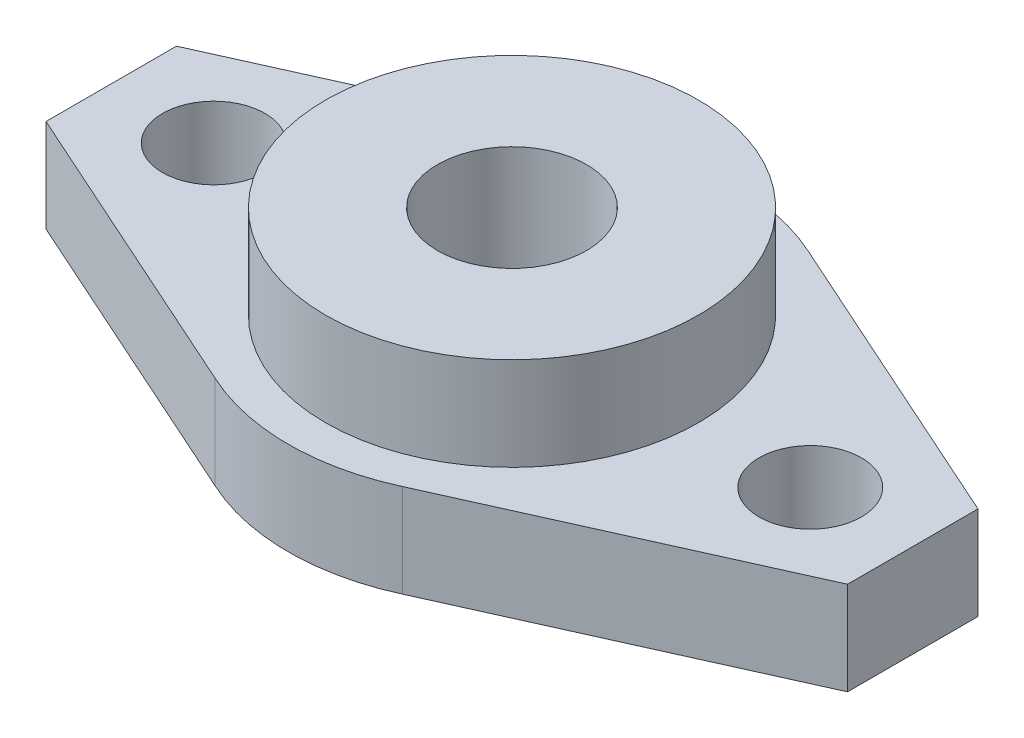
ISO-10303-21;
HEADER;
FILE_DESCRIPTION(('STEP AP214'),'2;1');
FILE_NAME('part.step','',(''),(''),'','','');
FILE_SCHEMA(('AUTOMOTIVE_DESIGN { 1 0 10303 214 1 1 1 1 }'));
ENDSEC;
DATA;
#1=APPLICATION_CONTEXT('core data for automotive mechanical design processes');
#2=APPLICATION_PROTOCOL_DEFINITION('international standard','automotive_design',2000,#1);
#3=PRODUCT_CONTEXT('',#1,'mechanical');
#4=PRODUCT('Part','Part','',(#3));
#5=PRODUCT_RELATED_PRODUCT_CATEGORY('part','',(#4));
#6=PRODUCT_DEFINITION_FORMATION('','',#4);
#7=PRODUCT_DEFINITION_CONTEXT('part definition',#1,'design');
#8=PRODUCT_DEFINITION('design','',#6,#7);
#9=PRODUCT_DEFINITION_SHAPE('','',#8);
#10=(LENGTH_UNIT() NAMED_UNIT(*) SI_UNIT(.MILLI.,.METRE.));
#11=(NAMED_UNIT(*) PLANE_ANGLE_UNIT() SI_UNIT($,.RADIAN.));
#12=(NAMED_UNIT(*) SI_UNIT($,.STERADIAN.) SOLID_ANGLE_UNIT());
#13=UNCERTAINTY_MEASURE_WITH_UNIT(LENGTH_MEASURE(1.E-05),#10,'distance_accuracy_value','');
#14=(GEOMETRIC_REPRESENTATION_CONTEXT(3) GLOBAL_UNCERTAINTY_ASSIGNED_CONTEXT((#13)) GLOBAL_UNIT_ASSIGNED_CONTEXT((#10,
#11,#12)) REPRESENTATION_CONTEXT('',''));
#15=CARTESIAN_POINT('',(0.,0.,0.));
#16=DIRECTION('',(0.,0.,1.));
#17=DIRECTION('',(1.,0.,0.));
#18=AXIS2_PLACEMENT_3D('',#15,#16,#17);
#19=CARTESIAN_POINT('',(0.,5.,0.));
#20=DIRECTION('',(0.,1.,0.));
#21=DIRECTION('',(0.,0.,1.));
#22=AXIS2_PLACEMENT_3D('',#19,#20,#21);
#23=PLANE('',#22);
#24=CARTESIAN_POINT('',(-16.,5.,0.));
#25=DIRECTION('',(0.,1.,0.));
#26=DIRECTION('',(0.,0.,1.));
#27=AXIS2_PLACEMENT_3D('',#24,#25,#26);
#28=CIRCLE('',#27,2.75);
#29=CARTESIAN_POINT('',(-16.,5.,2.75));
#30=VERTEX_POINT('',#29);
#31=EDGE_CURVE('E136',#30,#30,#28,.T.);
#32=ORIENTED_EDGE('',*,*,#31,.F.);
#33=EDGE_LOOP('',(#32));
#34=FACE_BOUND('',#33,.T.);
#35=CARTESIAN_POINT('',(16.,5.,0.));
#36=DIRECTION('',(0.,1.,0.));
#37=DIRECTION('',(0.,0.,1.));
#38=AXIS2_PLACEMENT_3D('',#35,#36,#37);
#39=CIRCLE('',#38,2.75);
#40=CARTESIAN_POINT('',(16.,5.,2.75));
#41=VERTEX_POINT('',#40);
#42=EDGE_CURVE('E129',#41,#41,#39,.T.);
#43=ORIENTED_EDGE('',*,*,#42,.F.);
#44=EDGE_LOOP('',(#43));
#45=FACE_BOUND('',#44,.T.);
#46=DIRECTION('',(-0.912263854888892,0.,-0.40960305060297));
#47=VECTOR('',#46,1.);
#48=CARTESIAN_POINT('',(4.91498637257068,5.,-10.9466089385009));
#49=LINE('',#48,#47);
#50=CARTESIAN_POINT('',(21.5,5.,-3.5));
#51=VERTEX_POINT('',#50);
#52=CARTESIAN_POINT('',(5.02544832268749,5.,-10.8970119370402));
#53=VERTEX_POINT('',#52);
#54=EDGE_CURVE('E163',#51,#53,#49,.T.);
#55=ORIENTED_EDGE('',*,*,#54,.T.);
#56=CARTESIAN_POINT('',(0.,5.,0.));
#57=DIRECTION('',(0.,1.,0.));
#58=DIRECTION('',(0.,0.,1.));
#59=AXIS2_PLACEMENT_3D('',#56,#57,#58);
#60=CIRCLE('',#59,12.);
#61=CARTESIAN_POINT('',(-5.02544832268749,5.,-10.8970119370402));
#62=VERTEX_POINT('',#61);
#63=EDGE_CURVE('E93',#53,#62,#60,.T.);
#64=ORIENTED_EDGE('',*,*,#63,.T.);
#65=DIRECTION('',(0.912263854888892,0.,-0.40960305060297));
#66=VECTOR('',#65,1.);
#67=CARTESIAN_POINT('',(-4.91498637257068,5.,-10.9466089385009));
#68=LINE('',#67,#66);
#69=CARTESIAN_POINT('',(-21.5,5.,-3.49999999999999));
#70=VERTEX_POINT('',#69);
#71=EDGE_CURVE('E176',#70,#62,#68,.T.);
#72=ORIENTED_EDGE('',*,*,#71,.F.);
#73=DIRECTION('',(0.,0.,1.));
#74=VECTOR('',#73,1.);
#75=CARTESIAN_POINT('',(-21.5,5.,0.));
#76=LINE('',#75,#74);
#77=CARTESIAN_POINT('',(-21.5,5.,3.50000000000001));
#78=VERTEX_POINT('',#77);
#79=EDGE_CURVE('E191',#70,#78,#76,.T.);
#80=ORIENTED_EDGE('',*,*,#79,.T.);
#81=DIRECTION('',(0.912263854888892,0.,0.40960305060297));
#82=VECTOR('',#81,1.);
#83=CARTESIAN_POINT('',(-4.91498637257067,5.,10.9466089385009));
#84=LINE('',#83,#82);
#85=CARTESIAN_POINT('',(-5.02544832268749,5.,10.8970119370402));
#86=VERTEX_POINT('',#85);
#87=EDGE_CURVE('E112',#78,#86,#84,.T.);
#88=ORIENTED_EDGE('',*,*,#87,.T.);
#89=CARTESIAN_POINT('',(5.02544832268749,5.,10.8970119370402));
#90=VERTEX_POINT('',#89);
#91=EDGE_CURVE('E106',#86,#90,#60,.T.);
#92=ORIENTED_EDGE('',*,*,#91,.T.);
#93=DIRECTION('',(-0.912263854888892,0.,0.40960305060297));
#94=VECTOR('',#93,1.);
#95=CARTESIAN_POINT('',(4.91498637257068,5.,10.9466089385009));
#96=LINE('',#95,#94);
#97=CARTESIAN_POINT('',(21.5,5.,3.5));
#98=VERTEX_POINT('',#97);
#99=EDGE_CURVE('E110',#98,#90,#96,.T.);
#100=ORIENTED_EDGE('',*,*,#99,.F.);
#101=DIRECTION('',(0.,0.,-1.));
#102=VECTOR('',#101,1.);
#103=CARTESIAN_POINT('',(21.5,5.,0.));
#104=LINE('',#103,#102);
#105=EDGE_CURVE('E54',#98,#51,#104,.T.);
#106=ORIENTED_EDGE('',*,*,#105,.T.);
#107=EDGE_LOOP('',(#55,#64,#72,#80,#88,#92,#100,#106));
#108=FACE_BOUND('',#107,.T.);
#109=CARTESIAN_POINT('',(0.,5.,0.));
#110=DIRECTION('',(0.,1.,0.));
#111=DIRECTION('',(0.,0.,1.));
#112=AXIS2_PLACEMENT_3D('',#109,#110,#111);
#113=CIRCLE('',#112,10.);
#114=CARTESIAN_POINT('',(0.,5.,10.));
#115=VERTEX_POINT('',#114);
#116=EDGE_CURVE('E195',#115,#115,#113,.T.);
#117=ORIENTED_EDGE('',*,*,#116,.F.);
#118=EDGE_LOOP('',(#117));
#119=FACE_BOUND('',#118,.T.);
#120=ADVANCED_FACE('F37',(#34,#45,#108,#119),#23,.T.);
#121=CARTESIAN_POINT('',(4.91498637257068,5.,-10.9466089385009));
#122=DIRECTION('',(-0.40960305060297,0.,0.912263854888892));
#123=DIRECTION('',(0.912263854888892,0.,0.40960305060297));
#124=AXIS2_PLACEMENT_3D('',#121,#122,#123);
#125=PLANE('',#124);
#126=DIRECTION('',(-0.912263854888892,0.,-0.40960305060297));
#127=VECTOR('',#126,1.);
#128=CARTESIAN_POINT('',(4.91498637257068,0.,-10.9466089385009));
#129=LINE('',#128,#127);
#130=CARTESIAN_POINT('',(21.5,0.,-3.5));
#131=VERTEX_POINT('',#130);
#132=CARTESIAN_POINT('',(5.02544832268749,0.,-10.8970119370402));
#133=VERTEX_POINT('',#132);
#134=EDGE_CURVE('E140',#131,#133,#129,.T.);
#135=ORIENTED_EDGE('',*,*,#134,.T.);
#136=DIRECTION('',(0.,-1.,0.));
#137=VECTOR('',#136,1.);
#138=CARTESIAN_POINT('',(5.02544832268749,5.,-10.8970119370402));
#139=LINE('',#138,#137);
#140=EDGE_CURVE('E11',#53,#133,#139,.T.);
#141=ORIENTED_EDGE('',*,*,#140,.F.);
#142=ORIENTED_EDGE('',*,*,#54,.F.);
#143=DIRECTION('',(0.,-1.,0.));
#144=VECTOR('',#143,1.);
#145=CARTESIAN_POINT('',(21.5,5.,-3.5));
#146=LINE('',#145,#144);
#147=EDGE_CURVE('E139',#51,#131,#146,.T.);
#148=ORIENTED_EDGE('',*,*,#147,.T.);
#149=EDGE_LOOP('',(#135,#141,#142,#148));
#150=FACE_BOUND('',#149,.T.);
#151=ADVANCED_FACE('F39',(#150),#125,.F.);
#152=CARTESIAN_POINT('',(0.,5.,0.));
#153=DIRECTION('',(0.,-1.,0.));
#154=DIRECTION('',(0.,0.,-1.));
#155=AXIS2_PLACEMENT_3D('',#152,#153,#154);
#156=CYLINDRICAL_SURFACE('',#155,12.);
#157=CARTESIAN_POINT('',(0.,0.,0.));
#158=DIRECTION('',(0.,1.,0.));
#159=DIRECTION('',(0.,0.,1.));
#160=AXIS2_PLACEMENT_3D('',#157,#158,#159);
#161=CIRCLE('',#160,12.);
#162=CARTESIAN_POINT('',(-5.02544832268749,0.,-10.8970119370402));
#163=VERTEX_POINT('',#162);
#164=EDGE_CURVE('E143',#133,#163,#161,.T.);
#165=ORIENTED_EDGE('',*,*,#164,.T.);
#166=DIRECTION('',(0.,-1.,0.));
#167=VECTOR('',#166,1.);
#168=CARTESIAN_POINT('',(-5.02544832268749,5.,-10.8970119370402));
#169=LINE('',#168,#167);
#170=EDGE_CURVE('E46',#62,#163,#169,.T.);
#171=ORIENTED_EDGE('',*,*,#170,.F.);
#172=ORIENTED_EDGE('',*,*,#63,.F.);
#173=ORIENTED_EDGE('',*,*,#140,.T.);
#174=EDGE_LOOP('',(#165,#171,#172,#173));
#175=FACE_BOUND('',#174,.T.);
#176=ADVANCED_FACE('F177',(#175),#156,.T.);
#177=CARTESIAN_POINT('',(-4.91498637257068,5.,-10.9466089385009));
#178=DIRECTION('',(-0.40960305060297,0.,-0.912263854888892));
#179=DIRECTION('',(-0.912263854888892,0.,0.40960305060297));
#180=AXIS2_PLACEMENT_3D('',#177,#178,#179);
#181=PLANE('',#180);
#182=DIRECTION('',(0.912263854888892,0.,-0.40960305060297));
#183=VECTOR('',#182,1.);
#184=CARTESIAN_POINT('',(-4.91498637257068,0.,-10.9466089385009));
#185=LINE('',#184,#183);
#186=CARTESIAN_POINT('',(-21.5,0.,-3.49999999999999));
#187=VERTEX_POINT('',#186);
#188=EDGE_CURVE('E147',#187,#163,#185,.T.);
#189=ORIENTED_EDGE('',*,*,#188,.F.);
#190=DIRECTION('',(0.,-1.,0.));
#191=VECTOR('',#190,1.);
#192=CARTESIAN_POINT('',(-21.5,5.,-3.49999999999999));
#193=LINE('',#192,#191);
#194=EDGE_CURVE('E170',#70,#187,#193,.T.);
#195=ORIENTED_EDGE('',*,*,#194,.F.);
#196=ORIENTED_EDGE('',*,*,#71,.T.);
#197=ORIENTED_EDGE('',*,*,#170,.T.);
#198=EDGE_LOOP('',(#189,#195,#196,#197));
#199=FACE_BOUND('',#198,.T.);
#200=ADVANCED_FACE('F174',(#199),#181,.T.);
#201=CARTESIAN_POINT('',(-21.5,5.,0.));
#202=DIRECTION('',(1.,0.,0.));
#203=DIRECTION('',(0.,0.,-1.));
#204=AXIS2_PLACEMENT_3D('',#201,#202,#203);
#205=PLANE('',#204);
#206=DIRECTION('',(0.,0.,1.));
#207=VECTOR('',#206,1.);
#208=CARTESIAN_POINT('',(-21.5,0.,0.));
#209=LINE('',#208,#207);
#210=CARTESIAN_POINT('',(-21.5,0.,3.50000000000001));
#211=VERTEX_POINT('',#210);
#212=EDGE_CURVE('E150',#187,#211,#209,.T.);
#213=ORIENTED_EDGE('',*,*,#212,.T.);
#214=DIRECTION('',(0.,-1.,0.));
#215=VECTOR('',#214,1.);
#216=CARTESIAN_POINT('',(-21.5,5.,3.50000000000001));
#217=LINE('',#216,#215);
#218=EDGE_CURVE('E167',#78,#211,#217,.T.);
#219=ORIENTED_EDGE('',*,*,#218,.F.);
#220=ORIENTED_EDGE('',*,*,#79,.F.);
#221=ORIENTED_EDGE('',*,*,#194,.T.);
#222=EDGE_LOOP('',(#213,#219,#220,#221));
#223=FACE_BOUND('',#222,.T.);
#224=ADVANCED_FACE('F187',(#223),#205,.F.);
#225=CARTESIAN_POINT('',(-4.91498637257067,5.,10.9466089385009));
#226=DIRECTION('',(0.40960305060297,0.,-0.912263854888892));
#227=DIRECTION('',(-0.912263854888892,0.,-0.40960305060297));
#228=AXIS2_PLACEMENT_3D('',#225,#226,#227);
#229=PLANE('',#228);
#230=DIRECTION('',(0.912263854888892,0.,0.40960305060297));
#231=VECTOR('',#230,1.);
#232=CARTESIAN_POINT('',(-4.91498637257067,0.,10.9466089385009));
#233=LINE('',#232,#231);
#234=CARTESIAN_POINT('',(-5.02544832268749,0.,10.8970119370402));
#235=VERTEX_POINT('',#234);
#236=EDGE_CURVE('E152',#211,#235,#233,.T.);
#237=ORIENTED_EDGE('',*,*,#236,.T.);
#238=DIRECTION('',(0.,-1.,0.));
#239=VECTOR('',#238,1.);
#240=CARTESIAN_POINT('',(-5.02544832268749,5.,10.8970119370402));
#241=LINE('',#240,#239);
#242=EDGE_CURVE('E125',#86,#235,#241,.T.);
#243=ORIENTED_EDGE('',*,*,#242,.F.);
#244=ORIENTED_EDGE('',*,*,#87,.F.);
#245=ORIENTED_EDGE('',*,*,#218,.T.);
#246=EDGE_LOOP('',(#237,#243,#244,#245));
#247=FACE_BOUND('',#246,.T.);
#248=ADVANCED_FACE('F190',(#247),#229,.F.);
#249=CARTESIAN_POINT('',(5.02544832268749,0.,10.8970119370402));
#250=VERTEX_POINT('',#249);
#251=EDGE_CURVE('E121',#235,#250,#161,.T.);
#252=ORIENTED_EDGE('',*,*,#251,.T.);
#253=DIRECTION('',(0.,-1.,0.));
#254=VECTOR('',#253,1.);
#255=CARTESIAN_POINT('',(5.02544832268749,5.,10.8970119370402));
#256=LINE('',#255,#254);
#257=EDGE_CURVE('E118',#90,#250,#256,.T.);
#258=ORIENTED_EDGE('',*,*,#257,.F.);
#259=ORIENTED_EDGE('',*,*,#91,.F.);
#260=ORIENTED_EDGE('',*,*,#242,.T.);
#261=EDGE_LOOP('',(#252,#258,#259,#260));
#262=FACE_BOUND('',#261,.T.);
#263=ADVANCED_FACE('F119',(#262),#156,.T.);
#264=CARTESIAN_POINT('',(4.91498637257068,5.,10.9466089385009));
#265=DIRECTION('',(0.40960305060297,0.,0.912263854888892));
#266=DIRECTION('',(0.912263854888892,0.,-0.40960305060297));
#267=AXIS2_PLACEMENT_3D('',#264,#265,#266);
#268=PLANE('',#267);
#269=DIRECTION('',(-0.912263854888892,0.,0.40960305060297));
#270=VECTOR('',#269,1.);
#271=CARTESIAN_POINT('',(4.91498637257068,0.,10.9466089385009));
#272=LINE('',#271,#270);
#273=CARTESIAN_POINT('',(21.5,0.,3.5));
#274=VERTEX_POINT('',#273);
#275=EDGE_CURVE('E154',#274,#250,#272,.T.);
#276=ORIENTED_EDGE('',*,*,#275,.F.);
#277=DIRECTION('',(0.,-1.,0.));
#278=VECTOR('',#277,1.);
#279=CARTESIAN_POINT('',(21.5,5.,3.5));
#280=LINE('',#279,#278);
#281=EDGE_CURVE('E82',#98,#274,#280,.T.);
#282=ORIENTED_EDGE('',*,*,#281,.F.);
#283=ORIENTED_EDGE('',*,*,#99,.T.);
#284=ORIENTED_EDGE('',*,*,#257,.T.);
#285=EDGE_LOOP('',(#276,#282,#283,#284));
#286=FACE_BOUND('',#285,.T.);
#287=ADVANCED_FACE('F127',(#286),#268,.T.);
#288=CARTESIAN_POINT('',(16.,5.,0.));
#289=DIRECTION('',(0.,-1.,0.));
#290=DIRECTION('',(0.,0.,-1.));
#291=AXIS2_PLACEMENT_3D('',#288,#289,#290);
#292=CYLINDRICAL_SURFACE('',#291,2.75);
#293=ORIENTED_EDGE('',*,*,#42,.T.);
#294=EDGE_LOOP('',(#293));
#295=FACE_BOUND('',#294,.T.);
#296=CARTESIAN_POINT('',(16.,0.,0.));
#297=DIRECTION('',(0.,1.,0.));
#298=DIRECTION('',(0.,0.,1.));
#299=AXIS2_PLACEMENT_3D('',#296,#297,#298);
#300=CIRCLE('',#299,2.75);
#301=CARTESIAN_POINT('',(16.,0.,2.75));
#302=VERTEX_POINT('',#301);
#303=EDGE_CURVE('E157',#302,#302,#300,.T.);
#304=ORIENTED_EDGE('',*,*,#303,.F.);
#305=EDGE_LOOP('',(#304));
#306=FACE_BOUND('',#305,.T.);
#307=ADVANCED_FACE('F239',(#295,#306),#292,.F.);
#308=CARTESIAN_POINT('',(21.5,5.,0.));
#309=DIRECTION('',(-1.,0.,0.));
#310=DIRECTION('',(0.,0.,1.));
#311=AXIS2_PLACEMENT_3D('',#308,#309,#310);
#312=PLANE('',#311);
#313=DIRECTION('',(0.,0.,-1.));
#314=VECTOR('',#313,1.);
#315=CARTESIAN_POINT('',(21.5,0.,0.));
#316=LINE('',#315,#314);
#317=EDGE_CURVE('E85',#274,#131,#316,.T.);
#318=ORIENTED_EDGE('',*,*,#317,.T.);
#319=ORIENTED_EDGE('',*,*,#147,.F.);
#320=ORIENTED_EDGE('',*,*,#105,.F.);
#321=ORIENTED_EDGE('',*,*,#281,.T.);
#322=EDGE_LOOP('',(#318,#319,#320,#321));
#323=FACE_BOUND('',#322,.T.);
#324=ADVANCED_FACE('F237',(#323),#312,.F.);
#325=CARTESIAN_POINT('',(-16.,5.,0.));
#326=DIRECTION('',(0.,-1.,0.));
#327=DIRECTION('',(0.,0.,-1.));
#328=AXIS2_PLACEMENT_3D('',#325,#326,#327);
#329=CYLINDRICAL_SURFACE('',#328,2.75);
#330=ORIENTED_EDGE('',*,*,#31,.T.);
#331=EDGE_LOOP('',(#330));
#332=FACE_BOUND('',#331,.T.);
#333=CARTESIAN_POINT('',(-16.,0.,0.));
#334=DIRECTION('',(0.,1.,0.));
#335=DIRECTION('',(0.,0.,1.));
#336=AXIS2_PLACEMENT_3D('',#333,#334,#335);
#337=CIRCLE('',#336,2.75);
#338=CARTESIAN_POINT('',(-16.,0.,2.75));
#339=VERTEX_POINT('',#338);
#340=EDGE_CURVE('E160',#339,#339,#337,.T.);
#341=ORIENTED_EDGE('',*,*,#340,.F.);
#342=EDGE_LOOP('',(#341));
#343=FACE_BOUND('',#342,.T.);
#344=ADVANCED_FACE('F233',(#332,#343),#329,.F.);
#345=CARTESIAN_POINT('',(0.,0.,0.));
#346=DIRECTION('',(0.,1.,0.));
#347=DIRECTION('',(0.,0.,1.));
#348=AXIS2_PLACEMENT_3D('',#345,#346,#347);
#349=PLANE('',#348);
#350=CARTESIAN_POINT('',(0.,0.,0.));
#351=DIRECTION('',(0.,1.,0.));
#352=DIRECTION('',(0.,0.,1.));
#353=AXIS2_PLACEMENT_3D('',#350,#351,#352);
#354=CIRCLE('',#353,4.);
#355=CARTESIAN_POINT('',(0.,0.,4.));
#356=VERTEX_POINT('',#355);
#357=EDGE_CURVE('E198',#356,#356,#354,.F.);
#358=ORIENTED_EDGE('',*,*,#357,.F.);
#359=EDGE_LOOP('',(#358));
#360=FACE_BOUND('',#359,.T.);
#361=ORIENTED_EDGE('',*,*,#134,.F.);
#362=ORIENTED_EDGE('',*,*,#317,.F.);
#363=ORIENTED_EDGE('',*,*,#275,.T.);
#364=ORIENTED_EDGE('',*,*,#251,.F.);
#365=ORIENTED_EDGE('',*,*,#236,.F.);
#366=ORIENTED_EDGE('',*,*,#212,.F.);
#367=ORIENTED_EDGE('',*,*,#188,.T.);
#368=ORIENTED_EDGE('',*,*,#164,.F.);
#369=EDGE_LOOP('',(#361,#362,#363,#364,#365,#366,#367,#368));
#370=FACE_BOUND('',#369,.T.);
#371=ORIENTED_EDGE('',*,*,#303,.T.);
#372=EDGE_LOOP('',(#371));
#373=FACE_BOUND('',#372,.T.);
#374=ORIENTED_EDGE('',*,*,#340,.T.);
#375=EDGE_LOOP('',(#374));
#376=FACE_BOUND('',#375,.T.);
#377=ADVANCED_FACE('F182',(#360,#370,#373,#376),#349,.F.);
#378=CARTESIAN_POINT('',(0.,10.,0.));
#379=DIRECTION('',(0.,-1.,0.));
#380=DIRECTION('',(0.,0.,-1.));
#381=AXIS2_PLACEMENT_3D('',#378,#379,#380);
#382=CYLINDRICAL_SURFACE('',#381,10.);
#383=CARTESIAN_POINT('',(0.,10.,0.));
#384=DIRECTION('',(0.,1.,0.));
#385=DIRECTION('',(0.,0.,1.));
#386=AXIS2_PLACEMENT_3D('',#383,#384,#385);
#387=CIRCLE('',#386,10.);
#388=CARTESIAN_POINT('',(0.,10.,10.));
#389=VERTEX_POINT('',#388);
#390=EDGE_CURVE('E144',#389,#389,#387,.T.);
#391=ORIENTED_EDGE('',*,*,#390,.F.);
#392=EDGE_LOOP('',(#391));
#393=FACE_BOUND('',#392,.T.);
#394=ORIENTED_EDGE('',*,*,#116,.T.);
#395=EDGE_LOOP('',(#394));
#396=FACE_BOUND('',#395,.T.);
#397=ADVANCED_FACE('F213',(#393,#396),#382,.T.);
#398=CARTESIAN_POINT('',(0.,10.,0.));
#399=DIRECTION('',(0.,1.,0.));
#400=DIRECTION('',(0.,0.,1.));
#401=AXIS2_PLACEMENT_3D('',#398,#399,#400);
#402=PLANE('',#401);
#403=CARTESIAN_POINT('',(0.,10.,0.));
#404=DIRECTION('',(0.,1.,0.));
#405=DIRECTION('',(0.,0.,1.));
#406=AXIS2_PLACEMENT_3D('',#403,#404,#405);
#407=CIRCLE('',#406,4.);
#408=CARTESIAN_POINT('',(0.,10.,4.));
#409=VERTEX_POINT('',#408);
#410=EDGE_CURVE('E203',#409,#409,#407,.T.);
#411=ORIENTED_EDGE('',*,*,#410,.F.);
#412=EDGE_LOOP('',(#411));
#413=FACE_BOUND('',#412,.T.);
#414=ORIENTED_EDGE('',*,*,#390,.T.);
#415=EDGE_LOOP('',(#414));
#416=FACE_BOUND('',#415,.T.);
#417=ADVANCED_FACE('F210',(#413,#416),#402,.T.);
#418=CARTESIAN_POINT('',(0.,-0.000999999999999265,0.));
#419=DIRECTION('',(0.,1.,0.));
#420=DIRECTION('',(0.,0.,1.));
#421=AXIS2_PLACEMENT_3D('',#418,#419,#420);
#422=CYLINDRICAL_SURFACE('',#421,4.);
#423=ORIENTED_EDGE('',*,*,#410,.T.);
#424=EDGE_LOOP('',(#423));
#425=FACE_BOUND('',#424,.T.);
#426=ORIENTED_EDGE('',*,*,#357,.T.);
#427=EDGE_LOOP('',(#426));
#428=FACE_BOUND('',#427,.T.);
#429=ADVANCED_FACE('F207',(#425,#428),#422,.F.);
#430=CLOSED_SHELL('',(#120,#151,#176,#200,#224,#248,#263,#287,#307,#324,#344,#377,#397,#417,#429));
#431=MANIFOLD_SOLID_BREP('B2',#430);
#432=ADVANCED_BREP_SHAPE_REPRESENTATION('',(#18,#431),#14);
#433=SHAPE_DEFINITION_REPRESENTATION(#9,#432);
ENDSEC;
END-ISO-10303-21;
